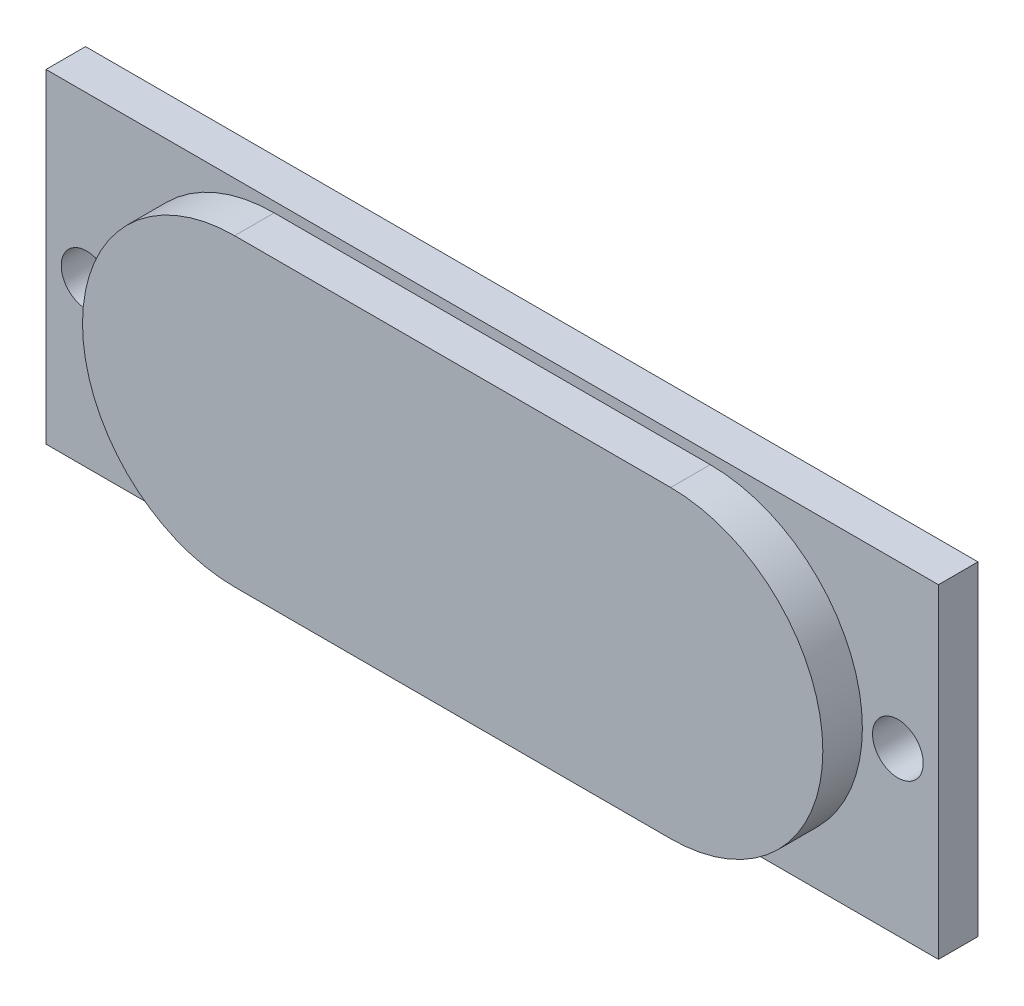
ISO-10303-21;
HEADER;
FILE_DESCRIPTION(('STEP AP214'),'2;1');
FILE_NAME('part.step','',(''),(''),'','','');
FILE_SCHEMA(('AUTOMOTIVE_DESIGN { 1 0 10303 214 1 1 1 1 }'));
ENDSEC;
DATA;
#1=APPLICATION_CONTEXT('core data for automotive mechanical design processes');
#2=APPLICATION_PROTOCOL_DEFINITION('international standard','automotive_design',2000,#1);
#3=PRODUCT_CONTEXT('',#1,'mechanical');
#4=PRODUCT('Part','Part','',(#3));
#5=PRODUCT_RELATED_PRODUCT_CATEGORY('part','',(#4));
#6=PRODUCT_DEFINITION_FORMATION('','',#4);
#7=PRODUCT_DEFINITION_CONTEXT('part definition',#1,'design');
#8=PRODUCT_DEFINITION('design','',#6,#7);
#9=PRODUCT_DEFINITION_SHAPE('','',#8);
#10=(LENGTH_UNIT() NAMED_UNIT(*) SI_UNIT(.MILLI.,.METRE.));
#11=(NAMED_UNIT(*) PLANE_ANGLE_UNIT() SI_UNIT($,.RADIAN.));
#12=(NAMED_UNIT(*) SI_UNIT($,.STERADIAN.) SOLID_ANGLE_UNIT());
#13=UNCERTAINTY_MEASURE_WITH_UNIT(LENGTH_MEASURE(1.E-05),#10,'distance_accuracy_value','');
#14=(GEOMETRIC_REPRESENTATION_CONTEXT(3) GLOBAL_UNCERTAINTY_ASSIGNED_CONTEXT((#13)) GLOBAL_UNIT_ASSIGNED_CONTEXT((#10,
#11,#12)) REPRESENTATION_CONTEXT('',''));
#15=CARTESIAN_POINT('',(0.,0.,0.));
#16=DIRECTION('',(0.,0.,1.));
#17=DIRECTION('',(1.,0.,0.));
#18=AXIS2_PLACEMENT_3D('',#15,#16,#17);
#19=CARTESIAN_POINT('',(0.,0.,4.953));
#20=DIRECTION('',(0.,0.,1.));
#21=DIRECTION('',(1.,0.,0.));
#22=AXIS2_PLACEMENT_3D('',#19,#20,#21);
#23=PLANE('',#22);
#24=DIRECTION('',(0.,-1.,0.));
#25=VECTOR('',#24,1.);
#26=CARTESIAN_POINT('',(55.88,0.,4.953));
#27=LINE('',#26,#25);
#28=CARTESIAN_POINT('',(55.88,20.32,4.953));
#29=VERTEX_POINT('',#28);
#30=CARTESIAN_POINT('',(55.88,-20.32,4.953));
#31=VERTEX_POINT('',#30);
#32=EDGE_CURVE('E141',#29,#31,#27,.T.);
#33=ORIENTED_EDGE('',*,*,#32,.F.);
#34=DIRECTION('',(1.,0.,0.));
#35=VECTOR('',#34,1.);
#36=CARTESIAN_POINT('',(0.,20.32,4.953));
#37=LINE('',#36,#35);
#38=CARTESIAN_POINT('',(-55.88,20.32,4.953));
#39=VERTEX_POINT('',#38);
#40=EDGE_CURVE('E144',#39,#29,#37,.T.);
#41=ORIENTED_EDGE('',*,*,#40,.F.);
#42=DIRECTION('',(0.,-1.,0.));
#43=VECTOR('',#42,1.);
#44=CARTESIAN_POINT('',(-55.88,0.,4.953));
#45=LINE('',#44,#43);
#46=CARTESIAN_POINT('',(-55.88,-20.32,4.953));
#47=VERTEX_POINT('',#46);
#48=EDGE_CURVE('E148',#39,#47,#45,.T.);
#49=ORIENTED_EDGE('',*,*,#48,.T.);
#50=DIRECTION('',(-1.,0.,0.));
#51=VECTOR('',#50,1.);
#52=CARTESIAN_POINT('',(0.,-20.32,4.953));
#53=LINE('',#52,#51);
#54=EDGE_CURVE('E150',#31,#47,#53,.T.);
#55=ORIENTED_EDGE('',*,*,#54,.F.);
#56=EDGE_LOOP('',(#33,#41,#49,#55));
#57=FACE_BOUND('',#56,.T.);
#58=CARTESIAN_POINT('',(50.8,0.,4.953));
#59=DIRECTION('',(0.,0.,1.));
#60=DIRECTION('',(1.,0.,0.));
#61=AXIS2_PLACEMENT_3D('',#58,#59,#60);
#62=CIRCLE('',#61,3.175);
#63=CARTESIAN_POINT('',(53.975,0.,4.953));
#64=VERTEX_POINT('',#63);
#65=EDGE_CURVE('E153',#64,#64,#62,.T.);
#66=ORIENTED_EDGE('',*,*,#65,.F.);
#67=EDGE_LOOP('',(#66));
#68=FACE_BOUND('',#67,.T.);
#69=CARTESIAN_POINT('',(-50.8,0.,4.953));
#70=DIRECTION('',(0.,0.,1.));
#71=DIRECTION('',(1.,0.,0.));
#72=AXIS2_PLACEMENT_3D('',#69,#70,#71);
#73=CIRCLE('',#72,3.175);
#74=CARTESIAN_POINT('',(-47.625,0.,4.953));
#75=VERTEX_POINT('',#74);
#76=EDGE_CURVE('E156',#75,#75,#73,.F.);
#77=ORIENTED_EDGE('',*,*,#76,.T.);
#78=EDGE_LOOP('',(#77));
#79=FACE_BOUND('',#78,.T.);
#80=DIRECTION('',(-1.,0.,0.));
#81=VECTOR('',#80,1.);
#82=CARTESIAN_POINT('',(27.305,19.05,4.953));
#83=LINE('',#82,#81);
#84=CARTESIAN_POINT('',(27.305,19.05,4.953));
#85=VERTEX_POINT('',#84);
#86=CARTESIAN_POINT('',(-27.305,19.05,4.953));
#87=VERTEX_POINT('',#86);
#88=EDGE_CURVE('E62',#85,#87,#83,.T.);
#89=ORIENTED_EDGE('',*,*,#88,.F.);
#90=CARTESIAN_POINT('',(27.305,0.,4.953));
#91=DIRECTION('',(0.,0.,1.));
#92=DIRECTION('',(1.,0.,0.));
#93=AXIS2_PLACEMENT_3D('',#90,#91,#92);
#94=CIRCLE('',#93,19.05);
#95=CARTESIAN_POINT('',(27.305,-19.05,4.953));
#96=VERTEX_POINT('',#95);
#97=EDGE_CURVE('E131',#96,#85,#94,.T.);
#98=ORIENTED_EDGE('',*,*,#97,.F.);
#99=DIRECTION('',(-1.,0.,0.));
#100=VECTOR('',#99,1.);
#101=CARTESIAN_POINT('',(27.305,-19.05,4.953));
#102=LINE('',#101,#100);
#103=CARTESIAN_POINT('',(-27.305,-19.05,4.953));
#104=VERTEX_POINT('',#103);
#105=EDGE_CURVE('E128',#96,#104,#102,.T.);
#106=ORIENTED_EDGE('',*,*,#105,.T.);
#107=CARTESIAN_POINT('',(-27.305,0.,4.953));
#108=DIRECTION('',(0.,0.,1.));
#109=DIRECTION('',(1.,0.,0.));
#110=AXIS2_PLACEMENT_3D('',#107,#108,#109);
#111=CIRCLE('',#110,19.05);
#112=EDGE_CURVE('E67',#87,#104,#111,.T.);
#113=ORIENTED_EDGE('',*,*,#112,.F.);
#114=EDGE_LOOP('',(#89,#98,#106,#113));
#115=FACE_BOUND('',#114,.T.);
#116=ADVANCED_FACE('F47',(#57,#68,#79,#115),#23,.T.);
#117=CARTESIAN_POINT('',(55.88,0.,4.953));
#118=DIRECTION('',(1.,0.,0.));
#119=DIRECTION('',(0.,1.,0.));
#120=AXIS2_PLACEMENT_3D('',#117,#118,#119);
#121=PLANE('',#120);
#122=DIRECTION('',(0.,-1.,0.));
#123=VECTOR('',#122,1.);
#124=CARTESIAN_POINT('',(55.88,0.,0.));
#125=LINE('',#124,#123);
#126=CARTESIAN_POINT('',(55.88,20.32,0.));
#127=VERTEX_POINT('',#126);
#128=CARTESIAN_POINT('',(55.88,-20.32,0.));
#129=VERTEX_POINT('',#128);
#130=EDGE_CURVE('E132',#127,#129,#125,.T.);
#131=ORIENTED_EDGE('',*,*,#130,.F.);
#132=DIRECTION('',(0.,0.,-1.));
#133=VECTOR('',#132,1.);
#134=CARTESIAN_POINT('',(55.88,20.32,4.953));
#135=LINE('',#134,#133);
#136=EDGE_CURVE('E11',#29,#127,#135,.T.);
#137=ORIENTED_EDGE('',*,*,#136,.F.);
#138=ORIENTED_EDGE('',*,*,#32,.T.);
#139=DIRECTION('',(0.,0.,-1.));
#140=VECTOR('',#139,1.);
#141=CARTESIAN_POINT('',(55.88,-20.32,4.953));
#142=LINE('',#141,#140);
#143=EDGE_CURVE('E158',#31,#129,#142,.T.);
#144=ORIENTED_EDGE('',*,*,#143,.T.);
#145=EDGE_LOOP('',(#131,#137,#138,#144));
#146=FACE_BOUND('',#145,.T.);
#147=ADVANCED_FACE('F49',(#146),#121,.T.);
#148=CARTESIAN_POINT('',(0.,20.32,4.953));
#149=DIRECTION('',(0.,1.,0.));
#150=DIRECTION('',(-1.,0.,0.));
#151=AXIS2_PLACEMENT_3D('',#148,#149,#150);
#152=PLANE('',#151);
#153=DIRECTION('',(1.,0.,0.));
#154=VECTOR('',#153,1.);
#155=CARTESIAN_POINT('',(0.,20.32,0.));
#156=LINE('',#155,#154);
#157=CARTESIAN_POINT('',(-55.88,20.32,0.));
#158=VERTEX_POINT('',#157);
#159=EDGE_CURVE('E135',#158,#127,#156,.T.);
#160=ORIENTED_EDGE('',*,*,#159,.F.);
#161=DIRECTION('',(0.,0.,-1.));
#162=VECTOR('',#161,1.);
#163=CARTESIAN_POINT('',(-55.88,20.32,4.953));
#164=LINE('',#163,#162);
#165=EDGE_CURVE('E55',#39,#158,#164,.T.);
#166=ORIENTED_EDGE('',*,*,#165,.F.);
#167=ORIENTED_EDGE('',*,*,#40,.T.);
#168=ORIENTED_EDGE('',*,*,#136,.T.);
#169=EDGE_LOOP('',(#160,#166,#167,#168));
#170=FACE_BOUND('',#169,.T.);
#171=ADVANCED_FACE('F187',(#170),#152,.T.);
#172=CARTESIAN_POINT('',(-55.88,0.,4.953));
#173=DIRECTION('',(1.,0.,0.));
#174=DIRECTION('',(0.,0.,-1.));
#175=AXIS2_PLACEMENT_3D('',#172,#173,#174);
#176=PLANE('',#175);
#177=DIRECTION('',(0.,-1.,0.));
#178=VECTOR('',#177,1.);
#179=CARTESIAN_POINT('',(-55.88,0.,0.));
#180=LINE('',#179,#178);
#181=CARTESIAN_POINT('',(-55.88,-20.32,0.));
#182=VERTEX_POINT('',#181);
#183=EDGE_CURVE('E162',#158,#182,#180,.T.);
#184=ORIENTED_EDGE('',*,*,#183,.T.);
#185=DIRECTION('',(0.,0.,-1.));
#186=VECTOR('',#185,1.);
#187=CARTESIAN_POINT('',(-55.88,-20.32,4.953));
#188=LINE('',#187,#186);
#189=EDGE_CURVE('E174',#47,#182,#188,.T.);
#190=ORIENTED_EDGE('',*,*,#189,.F.);
#191=ORIENTED_EDGE('',*,*,#48,.F.);
#192=ORIENTED_EDGE('',*,*,#165,.T.);
#193=EDGE_LOOP('',(#184,#190,#191,#192));
#194=FACE_BOUND('',#193,.T.);
#195=ADVANCED_FACE('F178',(#194),#176,.F.);
#196=CARTESIAN_POINT('',(50.8,0.,4.953));
#197=DIRECTION('',(0.,0.,-1.));
#198=DIRECTION('',(-1.,0.,0.));
#199=AXIS2_PLACEMENT_3D('',#196,#197,#198);
#200=CYLINDRICAL_SURFACE('',#199,3.175);
#201=ORIENTED_EDGE('',*,*,#65,.T.);
#202=EDGE_LOOP('',(#201));
#203=FACE_BOUND('',#202,.T.);
#204=CARTESIAN_POINT('',(50.8,0.,0.));
#205=DIRECTION('',(0.,0.,1.));
#206=DIRECTION('',(1.,0.,0.));
#207=AXIS2_PLACEMENT_3D('',#204,#205,#206);
#208=CIRCLE('',#207,3.175);
#209=CARTESIAN_POINT('',(53.975,0.,0.));
#210=VERTEX_POINT('',#209);
#211=EDGE_CURVE('E168',#210,#210,#208,.T.);
#212=ORIENTED_EDGE('',*,*,#211,.F.);
#213=EDGE_LOOP('',(#212));
#214=FACE_BOUND('',#213,.T.);
#215=ADVANCED_FACE('F216',(#203,#214),#200,.F.);
#216=CARTESIAN_POINT('',(0.,-20.32,4.953));
#217=DIRECTION('',(0.,-1.,0.));
#218=DIRECTION('',(1.,0.,0.));
#219=AXIS2_PLACEMENT_3D('',#216,#217,#218);
#220=PLANE('',#219);
#221=DIRECTION('',(-1.,0.,0.));
#222=VECTOR('',#221,1.);
#223=CARTESIAN_POINT('',(0.,-20.32,0.));
#224=LINE('',#223,#222);
#225=EDGE_CURVE('E165',#129,#182,#224,.T.);
#226=ORIENTED_EDGE('',*,*,#225,.F.);
#227=ORIENTED_EDGE('',*,*,#143,.F.);
#228=ORIENTED_EDGE('',*,*,#54,.T.);
#229=ORIENTED_EDGE('',*,*,#189,.T.);
#230=EDGE_LOOP('',(#226,#227,#228,#229));
#231=FACE_BOUND('',#230,.T.);
#232=ADVANCED_FACE('F192',(#231),#220,.T.);
#233=CARTESIAN_POINT('',(-50.8,0.,4.953));
#234=DIRECTION('',(0.,0.,-1.));
#235=DIRECTION('',(-1.,0.,0.));
#236=AXIS2_PLACEMENT_3D('',#233,#234,#235);
#237=CYLINDRICAL_SURFACE('',#236,3.175);
#238=ORIENTED_EDGE('',*,*,#76,.F.);
#239=EDGE_LOOP('',(#238));
#240=FACE_BOUND('',#239,.T.);
#241=CARTESIAN_POINT('',(-50.8,0.,0.));
#242=DIRECTION('',(0.,0.,1.));
#243=DIRECTION('',(1.,0.,0.));
#244=AXIS2_PLACEMENT_3D('',#241,#242,#243);
#245=CIRCLE('',#244,3.175);
#246=CARTESIAN_POINT('',(-47.625,0.,0.));
#247=VERTEX_POINT('',#246);
#248=EDGE_CURVE('E145',#247,#247,#245,.F.);
#249=ORIENTED_EDGE('',*,*,#248,.T.);
#250=EDGE_LOOP('',(#249));
#251=FACE_BOUND('',#250,.T.);
#252=ADVANCED_FACE('F202',(#240,#251),#237,.F.);
#253=CARTESIAN_POINT('',(0.,0.,0.));
#254=DIRECTION('',(0.,0.,1.));
#255=DIRECTION('',(1.,0.,0.));
#256=AXIS2_PLACEMENT_3D('',#253,#254,#255);
#257=PLANE('',#256);
#258=ORIENTED_EDGE('',*,*,#130,.T.);
#259=ORIENTED_EDGE('',*,*,#225,.T.);
#260=ORIENTED_EDGE('',*,*,#183,.F.);
#261=ORIENTED_EDGE('',*,*,#159,.T.);
#262=EDGE_LOOP('',(#258,#259,#260,#261));
#263=FACE_BOUND('',#262,.T.);
#264=ORIENTED_EDGE('',*,*,#211,.T.);
#265=EDGE_LOOP('',(#264));
#266=FACE_BOUND('',#265,.T.);
#267=ORIENTED_EDGE('',*,*,#248,.F.);
#268=EDGE_LOOP('',(#267));
#269=FACE_BOUND('',#268,.T.);
#270=ADVANCED_FACE('F184',(#263,#266,#269),#257,.F.);
#271=CARTESIAN_POINT('',(27.305,0.,9.906));
#272=DIRECTION('',(0.,0.,-1.));
#273=DIRECTION('',(-1.,0.,0.));
#274=AXIS2_PLACEMENT_3D('',#271,#272,#273);
#275=CYLINDRICAL_SURFACE('',#274,19.05);
#276=ORIENTED_EDGE('',*,*,#97,.T.);
#277=DIRECTION('',(0.,0.,-1.));
#278=VECTOR('',#277,1.);
#279=CARTESIAN_POINT('',(27.305,19.05,9.906));
#280=LINE('',#279,#278);
#281=CARTESIAN_POINT('',(27.305,19.05,9.906));
#282=VERTEX_POINT('',#281);
#283=EDGE_CURVE('E112',#282,#85,#280,.T.);
#284=ORIENTED_EDGE('',*,*,#283,.F.);
#285=CARTESIAN_POINT('',(27.305,0.,9.906));
#286=DIRECTION('',(0.,0.,1.));
#287=DIRECTION('',(1.,0.,0.));
#288=AXIS2_PLACEMENT_3D('',#285,#286,#287);
#289=CIRCLE('',#288,19.05);
#290=CARTESIAN_POINT('',(27.305,-19.05,9.906));
#291=VERTEX_POINT('',#290);
#292=EDGE_CURVE('E119',#291,#282,#289,.T.);
#293=ORIENTED_EDGE('',*,*,#292,.F.);
#294=DIRECTION('',(0.,0.,-1.));
#295=VECTOR('',#294,1.);
#296=CARTESIAN_POINT('',(27.305,-19.05,9.906));
#297=LINE('',#296,#295);
#298=EDGE_CURVE('E385',#291,#96,#297,.T.);
#299=ORIENTED_EDGE('',*,*,#298,.T.);
#300=EDGE_LOOP('',(#276,#284,#293,#299));
#301=FACE_BOUND('',#300,.T.);
#302=ADVANCED_FACE('F130',(#301),#275,.T.);
#303=CARTESIAN_POINT('',(27.305,19.05,9.906));
#304=DIRECTION('',(0.,-1.,0.));
#305=DIRECTION('',(1.,0.,0.));
#306=AXIS2_PLACEMENT_3D('',#303,#304,#305);
#307=PLANE('',#306);
#308=ORIENTED_EDGE('',*,*,#88,.T.);
#309=DIRECTION('',(0.,0.,-1.));
#310=VECTOR('',#309,1.);
#311=CARTESIAN_POINT('',(-27.305,19.05,9.906));
#312=LINE('',#311,#310);
#313=CARTESIAN_POINT('',(-27.305,19.05,9.906));
#314=VERTEX_POINT('',#313);
#315=EDGE_CURVE('E115',#314,#87,#312,.T.);
#316=ORIENTED_EDGE('',*,*,#315,.F.);
#317=DIRECTION('',(-1.,0.,0.));
#318=VECTOR('',#317,1.);
#319=CARTESIAN_POINT('',(27.305,19.05,9.906));
#320=LINE('',#319,#318);
#321=EDGE_CURVE('E108',#282,#314,#320,.T.);
#322=ORIENTED_EDGE('',*,*,#321,.F.);
#323=ORIENTED_EDGE('',*,*,#283,.T.);
#324=EDGE_LOOP('',(#308,#316,#322,#323));
#325=FACE_BOUND('',#324,.T.);
#326=ADVANCED_FACE('F110',(#325),#307,.F.);
#327=CARTESIAN_POINT('',(-27.305,0.,9.906));
#328=DIRECTION('',(0.,0.,-1.));
#329=DIRECTION('',(-1.,0.,0.));
#330=AXIS2_PLACEMENT_3D('',#327,#328,#329);
#331=CYLINDRICAL_SURFACE('',#330,19.05);
#332=ORIENTED_EDGE('',*,*,#112,.T.);
#333=DIRECTION('',(0.,0.,-1.));
#334=VECTOR('',#333,1.);
#335=CARTESIAN_POINT('',(-27.305,-19.05,9.906));
#336=LINE('',#335,#334);
#337=CARTESIAN_POINT('',(-27.305,-19.05,9.906));
#338=VERTEX_POINT('',#337);
#339=EDGE_CURVE('E137',#338,#104,#336,.T.);
#340=ORIENTED_EDGE('',*,*,#339,.F.);
#341=CARTESIAN_POINT('',(-27.305,0.,9.906));
#342=DIRECTION('',(0.,0.,1.));
#343=DIRECTION('',(1.,0.,0.));
#344=AXIS2_PLACEMENT_3D('',#341,#342,#343);
#345=CIRCLE('',#344,19.05);
#346=EDGE_CURVE('E118',#314,#338,#345,.T.);
#347=ORIENTED_EDGE('',*,*,#346,.F.);
#348=ORIENTED_EDGE('',*,*,#315,.T.);
#349=EDGE_LOOP('',(#332,#340,#347,#348));
#350=FACE_BOUND('',#349,.T.);
#351=ADVANCED_FACE('F329',(#350),#331,.T.);
#352=CARTESIAN_POINT('',(27.305,-19.05,9.906));
#353=DIRECTION('',(0.,-1.,0.));
#354=DIRECTION('',(1.,0.,0.));
#355=AXIS2_PLACEMENT_3D('',#352,#353,#354);
#356=PLANE('',#355);
#357=ORIENTED_EDGE('',*,*,#105,.F.);
#358=ORIENTED_EDGE('',*,*,#298,.F.);
#359=DIRECTION('',(-1.,0.,0.));
#360=VECTOR('',#359,1.);
#361=CARTESIAN_POINT('',(27.305,-19.05,9.906));
#362=LINE('',#361,#360);
#363=EDGE_CURVE('E125',#291,#338,#362,.T.);
#364=ORIENTED_EDGE('',*,*,#363,.T.);
#365=ORIENTED_EDGE('',*,*,#339,.T.);
#366=EDGE_LOOP('',(#357,#358,#364,#365));
#367=FACE_BOUND('',#366,.T.);
#368=ADVANCED_FACE('F339',(#367),#356,.T.);
#369=CARTESIAN_POINT('',(27.305,0.,9.906));
#370=DIRECTION('',(0.,0.,1.));
#371=DIRECTION('',(1.,0.,0.));
#372=AXIS2_PLACEMENT_3D('',#369,#370,#371);
#373=PLANE('',#372);
#374=ORIENTED_EDGE('',*,*,#292,.T.);
#375=ORIENTED_EDGE('',*,*,#321,.T.);
#376=ORIENTED_EDGE('',*,*,#346,.T.);
#377=ORIENTED_EDGE('',*,*,#363,.F.);
#378=EDGE_LOOP('',(#374,#375,#376,#377));
#379=FACE_BOUND('',#378,.T.);
#380=ADVANCED_FACE('F123',(#379),#373,.T.);
#381=CLOSED_SHELL('',(#116,#147,#171,#195,#215,#232,#252,#270,#302,#326,#351,#368,#380));
#382=MANIFOLD_SOLID_BREP('B2',#381);
#383=ADVANCED_BREP_SHAPE_REPRESENTATION('',(#18,#382),#14);
#384=SHAPE_DEFINITION_REPRESENTATION(#9,#383);
ENDSEC;
END-ISO-10303-21;
